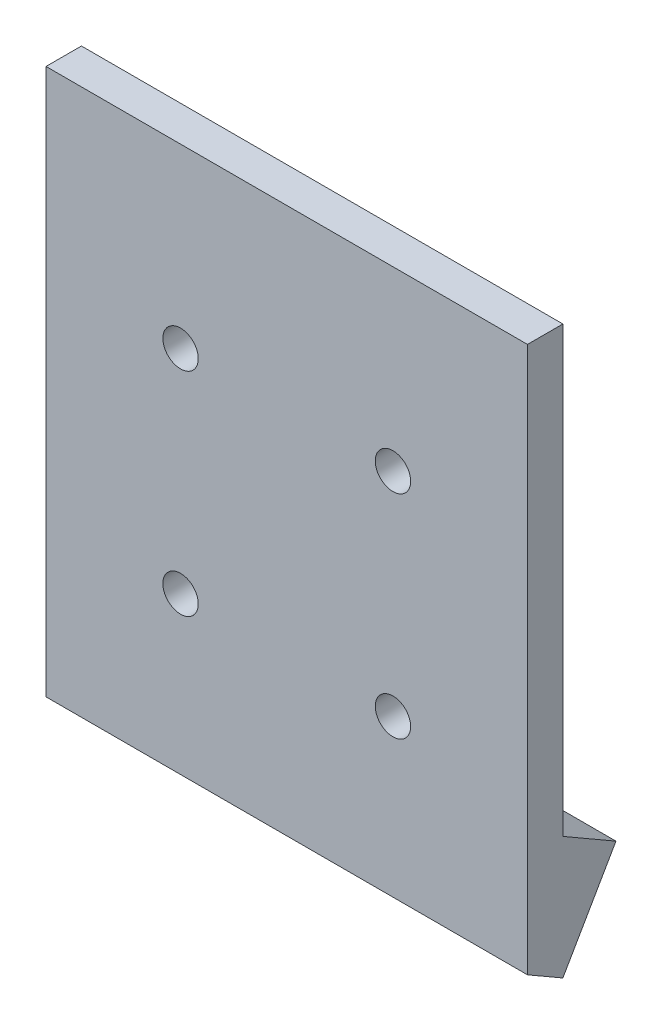
ISO-10303-21;
HEADER;
FILE_DESCRIPTION(('STEP AP214'),'2;1');
FILE_NAME('part.step','',(''),(''),'','','');
FILE_SCHEMA(('AUTOMOTIVE_DESIGN { 1 0 10303 214 1 1 1 1 }'));
ENDSEC;
DATA;
#1=APPLICATION_CONTEXT('core data for automotive mechanical design processes');
#2=APPLICATION_PROTOCOL_DEFINITION('international standard','automotive_design',2000,#1);
#3=PRODUCT_CONTEXT('',#1,'mechanical');
#4=PRODUCT('Part','Part','',(#3));
#5=PRODUCT_RELATED_PRODUCT_CATEGORY('part','',(#4));
#6=PRODUCT_DEFINITION_FORMATION('','',#4);
#7=PRODUCT_DEFINITION_CONTEXT('part definition',#1,'design');
#8=PRODUCT_DEFINITION('design','',#6,#7);
#9=PRODUCT_DEFINITION_SHAPE('','',#8);
#10=(LENGTH_UNIT() NAMED_UNIT(*) SI_UNIT(.MILLI.,.METRE.));
#11=(NAMED_UNIT(*) PLANE_ANGLE_UNIT() SI_UNIT($,.RADIAN.));
#12=(NAMED_UNIT(*) SI_UNIT($,.STERADIAN.) SOLID_ANGLE_UNIT());
#13=UNCERTAINTY_MEASURE_WITH_UNIT(LENGTH_MEASURE(1.E-05),#10,'distance_accuracy_value','');
#14=(GEOMETRIC_REPRESENTATION_CONTEXT(3) GLOBAL_UNCERTAINTY_ASSIGNED_CONTEXT((#13)) GLOBAL_UNIT_ASSIGNED_CONTEXT((#10,
#11,#12)) REPRESENTATION_CONTEXT('',''));
#15=CARTESIAN_POINT('',(0.,0.,0.));
#16=DIRECTION('',(0.,0.,1.));
#17=DIRECTION('',(1.,0.,0.));
#18=AXIS2_PLACEMENT_3D('',#15,#16,#17);
#19=CARTESIAN_POINT('',(0.,0.,6.35));
#20=DIRECTION('',(0.,0.,-1.));
#21=DIRECTION('',(-1.,0.,0.));
#22=AXIS2_PLACEMENT_3D('',#19,#20,#21);
#23=PLANE('',#22);
#24=DIRECTION('',(0.,-1.,0.));
#25=VECTOR('',#24,1.);
#26=CARTESIAN_POINT('',(-43.18,-50.8,6.35));
#27=LINE('',#26,#25);
#28=CARTESIAN_POINT('',(-43.18,50.8,6.35));
#29=VERTEX_POINT('',#28);
#30=CARTESIAN_POINT('',(-43.18,-47.1338257906459,6.35));
#31=VERTEX_POINT('',#30);
#32=EDGE_CURVE('E148',#29,#31,#27,.T.);
#33=ORIENTED_EDGE('',*,*,#32,.T.);
#34=DIRECTION('',(1.,0.,0.));
#35=VECTOR('',#34,1.);
#36=CARTESIAN_POINT('',(-43.18,-47.1338257906459,6.35));
#37=LINE('',#36,#35);
#38=CARTESIAN_POINT('',(43.18,-47.1338257906459,6.35));
#39=VERTEX_POINT('',#38);
#40=EDGE_CURVE('E84',#31,#39,#37,.T.);
#41=ORIENTED_EDGE('',*,*,#40,.T.);
#42=DIRECTION('',(0.,1.,0.));
#43=VECTOR('',#42,1.);
#44=CARTESIAN_POINT('',(43.18,-50.8,6.35));
#45=LINE('',#44,#43);
#46=CARTESIAN_POINT('',(43.18,50.8,6.35));
#47=VERTEX_POINT('',#46);
#48=EDGE_CURVE('E100',#39,#47,#45,.T.);
#49=ORIENTED_EDGE('',*,*,#48,.T.);
#50=DIRECTION('',(-1.,0.,0.));
#51=VECTOR('',#50,1.);
#52=CARTESIAN_POINT('',(-43.18,50.8,6.35));
#53=LINE('',#52,#51);
#54=EDGE_CURVE('E59',#47,#29,#53,.T.);
#55=ORIENTED_EDGE('',*,*,#54,.T.);
#56=EDGE_LOOP('',(#33,#41,#49,#55));
#57=FACE_BOUND('',#56,.T.);
#58=CARTESIAN_POINT('',(-19.05,19.05,6.35));
#59=DIRECTION('',(0.,0.,1.));
#60=DIRECTION('',(1.,0.,0.));
#61=AXIS2_PLACEMENT_3D('',#58,#59,#60);
#62=CIRCLE('',#61,3.175);
#63=CARTESIAN_POINT('',(-15.875,19.05,6.35));
#64=VERTEX_POINT('',#63);
#65=EDGE_CURVE('E140',#64,#64,#62,.T.);
#66=ORIENTED_EDGE('',*,*,#65,.F.);
#67=EDGE_LOOP('',(#66));
#68=FACE_BOUND('',#67,.T.);
#69=CARTESIAN_POINT('',(19.05,19.05,6.35));
#70=DIRECTION('',(0.,0.,1.));
#71=DIRECTION('',(1.,0.,0.));
#72=AXIS2_PLACEMENT_3D('',#69,#70,#71);
#73=CIRCLE('',#72,3.175);
#74=CARTESIAN_POINT('',(22.225,19.05,6.35));
#75=VERTEX_POINT('',#74);
#76=EDGE_CURVE('E134',#75,#75,#73,.T.);
#77=ORIENTED_EDGE('',*,*,#76,.F.);
#78=EDGE_LOOP('',(#77));
#79=FACE_BOUND('',#78,.T.);
#80=CARTESIAN_POINT('',(-19.05,-19.05,6.35));
#81=DIRECTION('',(0.,0.,1.));
#82=DIRECTION('',(1.,0.,0.));
#83=AXIS2_PLACEMENT_3D('',#80,#81,#82);
#84=CIRCLE('',#83,3.175);
#85=CARTESIAN_POINT('',(-15.875,-19.05,6.35));
#86=VERTEX_POINT('',#85);
#87=EDGE_CURVE('E128',#86,#86,#84,.T.);
#88=ORIENTED_EDGE('',*,*,#87,.F.);
#89=EDGE_LOOP('',(#88));
#90=FACE_BOUND('',#89,.T.);
#91=CARTESIAN_POINT('',(19.05,-19.05,6.35));
#92=DIRECTION('',(0.,0.,1.));
#93=DIRECTION('',(1.,0.,0.));
#94=AXIS2_PLACEMENT_3D('',#91,#92,#93);
#95=CIRCLE('',#94,3.175);
#96=CARTESIAN_POINT('',(22.225,-19.05,6.35));
#97=VERTEX_POINT('',#96);
#98=EDGE_CURVE('E122',#97,#97,#95,.T.);
#99=ORIENTED_EDGE('',*,*,#98,.F.);
#100=EDGE_LOOP('',(#99));
#101=FACE_BOUND('',#100,.T.);
#102=ADVANCED_FACE('F33',(#57,#68,#79,#90,#101),#23,.F.);
#103=CARTESIAN_POINT('',(0.,0.,0.));
#104=DIRECTION('',(0.,0.,-1.));
#105=DIRECTION('',(-1.,0.,0.));
#106=AXIS2_PLACEMENT_3D('',#103,#104,#105);
#107=PLANE('',#106);
#108=DIRECTION('',(1.,0.,0.));
#109=VECTOR('',#108,1.);
#110=CARTESIAN_POINT('',(-43.18,-28.8029547438753,0.));
#111=LINE('',#110,#109);
#112=CARTESIAN_POINT('',(-43.18,-28.8029547438753,0.));
#113=VERTEX_POINT('',#112);
#114=CARTESIAN_POINT('',(43.18,-28.8029547438753,0.));
#115=VERTEX_POINT('',#114);
#116=EDGE_CURVE('E50',#113,#115,#111,.T.);
#117=ORIENTED_EDGE('',*,*,#116,.F.);
#118=DIRECTION('',(0.,-1.,0.));
#119=VECTOR('',#118,1.);
#120=CARTESIAN_POINT('',(-43.18,-50.8,0.));
#121=LINE('',#120,#119);
#122=CARTESIAN_POINT('',(-43.18,50.8,0.));
#123=VERTEX_POINT('',#122);
#124=EDGE_CURVE('E101',#123,#113,#121,.T.);
#125=ORIENTED_EDGE('',*,*,#124,.F.);
#126=DIRECTION('',(-1.,0.,0.));
#127=VECTOR('',#126,1.);
#128=CARTESIAN_POINT('',(-43.18,50.8,0.));
#129=LINE('',#128,#127);
#130=CARTESIAN_POINT('',(43.18,50.8,0.));
#131=VERTEX_POINT('',#130);
#132=EDGE_CURVE('E151',#131,#123,#129,.T.);
#133=ORIENTED_EDGE('',*,*,#132,.F.);
#134=DIRECTION('',(0.,1.,0.));
#135=VECTOR('',#134,1.);
#136=CARTESIAN_POINT('',(43.18,-50.8,0.));
#137=LINE('',#136,#135);
#138=EDGE_CURVE('E143',#115,#131,#137,.T.);
#139=ORIENTED_EDGE('',*,*,#138,.F.);
#140=EDGE_LOOP('',(#117,#125,#133,#139));
#141=FACE_BOUND('',#140,.T.);
#142=CARTESIAN_POINT('',(-19.05,-19.05,0.));
#143=DIRECTION('',(0.,0.,1.));
#144=DIRECTION('',(1.,0.,0.));
#145=AXIS2_PLACEMENT_3D('',#142,#143,#144);
#146=CIRCLE('',#145,3.175);
#147=CARTESIAN_POINT('',(-15.875,-19.05,0.));
#148=VERTEX_POINT('',#147);
#149=EDGE_CURVE('E125',#148,#148,#146,.T.);
#150=ORIENTED_EDGE('',*,*,#149,.T.);
#151=EDGE_LOOP('',(#150));
#152=FACE_BOUND('',#151,.T.);
#153=CARTESIAN_POINT('',(-19.05,19.05,0.));
#154=DIRECTION('',(0.,0.,1.));
#155=DIRECTION('',(1.,0.,0.));
#156=AXIS2_PLACEMENT_3D('',#153,#154,#155);
#157=CIRCLE('',#156,3.175);
#158=CARTESIAN_POINT('',(-15.875,19.05,0.));
#159=VERTEX_POINT('',#158);
#160=EDGE_CURVE('E137',#159,#159,#157,.T.);
#161=ORIENTED_EDGE('',*,*,#160,.T.);
#162=EDGE_LOOP('',(#161));
#163=FACE_BOUND('',#162,.T.);
#164=CARTESIAN_POINT('',(19.05,19.05,0.));
#165=DIRECTION('',(0.,0.,1.));
#166=DIRECTION('',(1.,0.,0.));
#167=AXIS2_PLACEMENT_3D('',#164,#165,#166);
#168=CIRCLE('',#167,3.175);
#169=CARTESIAN_POINT('',(22.225,19.05,0.));
#170=VERTEX_POINT('',#169);
#171=EDGE_CURVE('E131',#170,#170,#168,.T.);
#172=ORIENTED_EDGE('',*,*,#171,.T.);
#173=EDGE_LOOP('',(#172));
#174=FACE_BOUND('',#173,.T.);
#175=CARTESIAN_POINT('',(19.05,-19.05,0.));
#176=DIRECTION('',(0.,0.,1.));
#177=DIRECTION('',(1.,0.,0.));
#178=AXIS2_PLACEMENT_3D('',#175,#176,#177);
#179=CIRCLE('',#178,3.175);
#180=CARTESIAN_POINT('',(22.225,-19.05,0.));
#181=VERTEX_POINT('',#180);
#182=EDGE_CURVE('E121',#181,#181,#179,.T.);
#183=ORIENTED_EDGE('',*,*,#182,.T.);
#184=EDGE_LOOP('',(#183));
#185=FACE_BOUND('',#184,.T.);
#186=ADVANCED_FACE('F185',(#141,#152,#163,#174,#185),#107,.T.);
#187=CARTESIAN_POINT('',(43.18,-50.8,6.35));
#188=DIRECTION('',(-1.,0.,0.));
#189=DIRECTION('',(0.,0.,1.));
#190=AXIS2_PLACEMENT_3D('',#187,#188,#189);
#191=PLANE('',#190);
#192=ORIENTED_EDGE('',*,*,#48,.F.);
#193=DIRECTION('',(0.,0.499999999999994,0.866025403784442));
#194=VECTOR('',#193,1.);
#195=CARTESIAN_POINT('',(43.18,-50.8,0.));
#196=LINE('',#195,#194);
#197=CARTESIAN_POINT('',(43.18,-50.8,0.));
#198=VERTEX_POINT('',#197);
#199=EDGE_CURVE('E88',#198,#39,#196,.T.);
#200=ORIENTED_EDGE('',*,*,#199,.F.);
#201=DIRECTION('',(0.,0.866025403784442,-0.499999999999995));
#202=VECTOR('',#201,1.);
#203=CARTESIAN_POINT('',(43.18,-50.8,0.));
#204=LINE('',#203,#202);
#205=CARTESIAN_POINT('',(43.18,-34.3022160579064,-9.5249999999999));
#206=VERTEX_POINT('',#205);
#207=EDGE_CURVE('E99',#198,#206,#204,.T.);
#208=ORIENTED_EDGE('',*,*,#207,.T.);
#209=DIRECTION('',(0.,0.5,0.866025403784439));
#210=VECTOR('',#209,1.);
#211=CARTESIAN_POINT('',(43.18,-34.3022160579064,-9.5249999999999));
#212=LINE('',#211,#210);
#213=EDGE_CURVE('E106',#206,#115,#212,.T.);
#214=ORIENTED_EDGE('',*,*,#213,.T.);
#215=ORIENTED_EDGE('',*,*,#138,.T.);
#216=DIRECTION('',(0.,0.,-1.));
#217=VECTOR('',#216,1.);
#218=CARTESIAN_POINT('',(43.18,50.8,6.35));
#219=LINE('',#218,#217);
#220=EDGE_CURVE('E11',#47,#131,#219,.T.);
#221=ORIENTED_EDGE('',*,*,#220,.F.);
#222=EDGE_LOOP('',(#192,#200,#208,#214,#215,#221));
#223=FACE_BOUND('',#222,.T.);
#224=ADVANCED_FACE('F35',(#223),#191,.F.);
#225=CARTESIAN_POINT('',(-43.18,50.8,6.35));
#226=DIRECTION('',(0.,-1.,0.));
#227=DIRECTION('',(0.,0.,-1.));
#228=AXIS2_PLACEMENT_3D('',#225,#226,#227);
#229=PLANE('',#228);
#230=ORIENTED_EDGE('',*,*,#132,.T.);
#231=DIRECTION('',(0.,0.,-1.));
#232=VECTOR('',#231,1.);
#233=CARTESIAN_POINT('',(-43.18,50.8,6.35));
#234=LINE('',#233,#232);
#235=EDGE_CURVE('E42',#29,#123,#234,.T.);
#236=ORIENTED_EDGE('',*,*,#235,.F.);
#237=ORIENTED_EDGE('',*,*,#54,.F.);
#238=ORIENTED_EDGE('',*,*,#220,.T.);
#239=EDGE_LOOP('',(#230,#236,#237,#238));
#240=FACE_BOUND('',#239,.T.);
#241=ADVANCED_FACE('F197',(#240),#229,.F.);
#242=CARTESIAN_POINT('',(-43.18,-50.8,6.35));
#243=DIRECTION('',(1.,0.,0.));
#244=DIRECTION('',(0.,0.,-1.));
#245=AXIS2_PLACEMENT_3D('',#242,#243,#244);
#246=PLANE('',#245);
#247=ORIENTED_EDGE('',*,*,#124,.T.);
#248=DIRECTION('',(0.,0.5,0.866025403784439));
#249=VECTOR('',#248,1.);
#250=CARTESIAN_POINT('',(-43.18,-34.3022160579064,-9.5249999999999));
#251=LINE('',#250,#249);
#252=CARTESIAN_POINT('',(-43.18,-34.3022160579064,-9.5249999999999));
#253=VERTEX_POINT('',#252);
#254=EDGE_CURVE('E105',#253,#113,#251,.T.);
#255=ORIENTED_EDGE('',*,*,#254,.F.);
#256=DIRECTION('',(0.,0.866025403784442,-0.499999999999995));
#257=VECTOR('',#256,1.);
#258=CARTESIAN_POINT('',(-43.18,-50.8,0.));
#259=LINE('',#258,#257);
#260=CARTESIAN_POINT('',(-43.18,-50.8,0.));
#261=VERTEX_POINT('',#260);
#262=EDGE_CURVE('E96',#261,#253,#259,.T.);
#263=ORIENTED_EDGE('',*,*,#262,.F.);
#264=DIRECTION('',(0.,0.499999999999994,0.866025403784442));
#265=VECTOR('',#264,1.);
#266=CARTESIAN_POINT('',(-43.18,-50.8,0.));
#267=LINE('',#266,#265);
#268=EDGE_CURVE('E76',#261,#31,#267,.T.);
#269=ORIENTED_EDGE('',*,*,#268,.T.);
#270=ORIENTED_EDGE('',*,*,#32,.F.);
#271=ORIENTED_EDGE('',*,*,#235,.T.);
#272=EDGE_LOOP('',(#247,#255,#263,#269,#270,#271));
#273=FACE_BOUND('',#272,.T.);
#274=ADVANCED_FACE('F103',(#273),#246,.F.);
#275=CARTESIAN_POINT('',(-19.05,19.05,6.35));
#276=DIRECTION('',(0.,0.,-1.));
#277=DIRECTION('',(-1.,0.,0.));
#278=AXIS2_PLACEMENT_3D('',#275,#276,#277);
#279=CYLINDRICAL_SURFACE('',#278,3.175);
#280=ORIENTED_EDGE('',*,*,#65,.T.);
#281=EDGE_LOOP('',(#280));
#282=FACE_BOUND('',#281,.T.);
#283=ORIENTED_EDGE('',*,*,#160,.F.);
#284=EDGE_LOOP('',(#283));
#285=FACE_BOUND('',#284,.T.);
#286=ADVANCED_FACE('F193',(#282,#285),#279,.F.);
#287=CARTESIAN_POINT('',(19.05,19.05,6.35));
#288=DIRECTION('',(0.,0.,-1.));
#289=DIRECTION('',(-1.,0.,0.));
#290=AXIS2_PLACEMENT_3D('',#287,#288,#289);
#291=CYLINDRICAL_SURFACE('',#290,3.175);
#292=ORIENTED_EDGE('',*,*,#76,.T.);
#293=EDGE_LOOP('',(#292));
#294=FACE_BOUND('',#293,.T.);
#295=ORIENTED_EDGE('',*,*,#171,.F.);
#296=EDGE_LOOP('',(#295));
#297=FACE_BOUND('',#296,.T.);
#298=ADVANCED_FACE('F216',(#294,#297),#291,.F.);
#299=CARTESIAN_POINT('',(-19.05,-19.05,6.35));
#300=DIRECTION('',(0.,0.,-1.));
#301=DIRECTION('',(-1.,0.,0.));
#302=AXIS2_PLACEMENT_3D('',#299,#300,#301);
#303=CYLINDRICAL_SURFACE('',#302,3.175);
#304=ORIENTED_EDGE('',*,*,#87,.T.);
#305=EDGE_LOOP('',(#304));
#306=FACE_BOUND('',#305,.T.);
#307=ORIENTED_EDGE('',*,*,#149,.F.);
#308=EDGE_LOOP('',(#307));
#309=FACE_BOUND('',#308,.T.);
#310=ADVANCED_FACE('F180',(#306,#309),#303,.F.);
#311=CARTESIAN_POINT('',(19.05,-19.05,6.35));
#312=DIRECTION('',(0.,0.,-1.));
#313=DIRECTION('',(-1.,0.,0.));
#314=AXIS2_PLACEMENT_3D('',#311,#312,#313);
#315=CYLINDRICAL_SURFACE('',#314,3.175);
#316=ORIENTED_EDGE('',*,*,#98,.T.);
#317=EDGE_LOOP('',(#316));
#318=FACE_BOUND('',#317,.T.);
#319=ORIENTED_EDGE('',*,*,#182,.F.);
#320=EDGE_LOOP('',(#319));
#321=FACE_BOUND('',#320,.T.);
#322=ADVANCED_FACE('F171',(#318,#321),#315,.F.);
#323=CARTESIAN_POINT('',(-43.18,-50.8,0.));
#324=DIRECTION('',(0.,0.866025403784442,-0.499999999999995));
#325=DIRECTION('',(0.,0.499999999999995,0.866025403784442));
#326=AXIS2_PLACEMENT_3D('',#323,#324,#325);
#327=PLANE('',#326);
#328=CARTESIAN_POINT('',(-31.75,-48.966912895323,3.175));
#329=DIRECTION('',(0.,-0.866025403784442,0.499999999999995));
#330=DIRECTION('',(0.,-0.499999999999995,-0.866025403784442));
#331=AXIS2_PLACEMENT_3D('',#328,#329,#330);
#332=CIRCLE('',#331,2.1828125);
#333=CARTESIAN_POINT('',(-31.75,-50.058319145323,1.28462892330177));
#334=VERTEX_POINT('',#333);
#335=EDGE_CURVE('E157',#334,#334,#332,.T.);
#336=ORIENTED_EDGE('',*,*,#335,.F.);
#337=EDGE_LOOP('',(#336));
#338=FACE_BOUND('',#337,.T.);
#339=CARTESIAN_POINT('',(31.75,-48.966912895323,3.175));
#340=DIRECTION('',(0.,-0.866025403784442,0.499999999999995));
#341=DIRECTION('',(0.,-0.499999999999995,-0.866025403784442));
#342=AXIS2_PLACEMENT_3D('',#339,#340,#341);
#343=CIRCLE('',#342,2.1828125);
#344=CARTESIAN_POINT('',(31.75,-50.058319145323,1.28462892330177));
#345=VERTEX_POINT('',#344);
#346=EDGE_CURVE('E113',#345,#345,#343,.T.);
#347=ORIENTED_EDGE('',*,*,#346,.F.);
#348=EDGE_LOOP('',(#347));
#349=FACE_BOUND('',#348,.T.);
#350=ORIENTED_EDGE('',*,*,#199,.T.);
#351=ORIENTED_EDGE('',*,*,#40,.F.);
#352=ORIENTED_EDGE('',*,*,#268,.F.);
#353=DIRECTION('',(1.,0.,0.));
#354=VECTOR('',#353,1.);
#355=CARTESIAN_POINT('',(-43.18,-50.8,0.));
#356=LINE('',#355,#354);
#357=EDGE_CURVE('E81',#261,#198,#356,.T.);
#358=ORIENTED_EDGE('',*,*,#357,.T.);
#359=EDGE_LOOP('',(#350,#351,#352,#358));
#360=FACE_BOUND('',#359,.T.);
#361=ADVANCED_FACE('F79',(#338,#349,#360),#327,.F.);
#362=CARTESIAN_POINT('',(-43.18,-34.3022160579064,-9.5249999999999));
#363=DIRECTION('',(0.,0.866025403784439,-0.5));
#364=DIRECTION('',(0.,0.5,0.866025403784439));
#365=AXIS2_PLACEMENT_3D('',#362,#363,#364);
#366=PLANE('',#365);
#367=CARTESIAN_POINT('',(-31.75,-32.4691289532294,-6.34999999999992));
#368=DIRECTION('',(0.,0.866025403784439,-0.5));
#369=DIRECTION('',(0.,0.5,0.866025403784439));
#370=AXIS2_PLACEMENT_3D('',#367,#368,#369);
#371=CIRCLE('',#370,2.1828125);
#372=CARTESIAN_POINT('',(-31.75,-31.3777227032293,-4.4596289233017));
#373=VERTEX_POINT('',#372);
#374=EDGE_CURVE('E37',#373,#373,#371,.T.);
#375=ORIENTED_EDGE('',*,*,#374,.F.);
#376=EDGE_LOOP('',(#375));
#377=FACE_BOUND('',#376,.T.);
#378=CARTESIAN_POINT('',(31.75,-32.4691289532294,-6.34999999999992));
#379=DIRECTION('',(0.,0.866025403784439,-0.5));
#380=DIRECTION('',(0.,0.5,0.866025403784439));
#381=AXIS2_PLACEMENT_3D('',#378,#379,#380);
#382=CIRCLE('',#381,2.1828125);
#383=CARTESIAN_POINT('',(31.75,-31.3777227032293,-4.4596289233017));
#384=VERTEX_POINT('',#383);
#385=EDGE_CURVE('E155',#384,#384,#382,.T.);
#386=ORIENTED_EDGE('',*,*,#385,.F.);
#387=EDGE_LOOP('',(#386));
#388=FACE_BOUND('',#387,.T.);
#389=ORIENTED_EDGE('',*,*,#213,.F.);
#390=DIRECTION('',(1.,0.,0.));
#391=VECTOR('',#390,1.);
#392=CARTESIAN_POINT('',(-43.18,-34.3022160579064,-9.5249999999999));
#393=LINE('',#392,#391);
#394=EDGE_CURVE('E108',#253,#206,#393,.T.);
#395=ORIENTED_EDGE('',*,*,#394,.F.);
#396=ORIENTED_EDGE('',*,*,#254,.T.);
#397=ORIENTED_EDGE('',*,*,#116,.T.);
#398=EDGE_LOOP('',(#389,#395,#396,#397));
#399=FACE_BOUND('',#398,.T.);
#400=ADVANCED_FACE('F170',(#377,#388,#399),#366,.T.);
#401=CARTESIAN_POINT('',(-43.18,-50.8,0.));
#402=DIRECTION('',(0.,-0.499999999999995,-0.866025403784442));
#403=DIRECTION('',(0.,0.866025403784442,-0.499999999999995));
#404=AXIS2_PLACEMENT_3D('',#401,#402,#403);
#405=PLANE('',#404);
#406=ORIENTED_EDGE('',*,*,#207,.F.);
#407=ORIENTED_EDGE('',*,*,#357,.F.);
#408=ORIENTED_EDGE('',*,*,#262,.T.);
#409=ORIENTED_EDGE('',*,*,#394,.T.);
#410=EDGE_LOOP('',(#406,#407,#408,#409));
#411=FACE_BOUND('',#410,.T.);
#412=ADVANCED_FACE('F93',(#411),#405,.T.);
#413=CARTESIAN_POINT('',(31.75,31.3575330902009,-43.2003405122491));
#414=DIRECTION('',(0.,-0.866025403784442,0.499999999999995));
#415=DIRECTION('',(0.,-0.499999999999995,-0.866025403784442));
#416=AXIS2_PLACEMENT_3D('',#413,#414,#415);
#417=CYLINDRICAL_SURFACE('',#416,2.1828125);
#418=ORIENTED_EDGE('',*,*,#385,.T.);
#419=EDGE_LOOP('',(#418));
#420=FACE_BOUND('',#419,.T.);
#421=ORIENTED_EDGE('',*,*,#346,.T.);
#422=EDGE_LOOP('',(#421));
#423=FACE_BOUND('',#422,.T.);
#424=ADVANCED_FACE('F167',(#420,#423),#417,.F.);
#425=CARTESIAN_POINT('',(-31.75,31.3575330902009,-43.2003405122491));
#426=DIRECTION('',(0.,-0.866025403784442,0.499999999999995));
#427=DIRECTION('',(0.,-0.499999999999995,-0.866025403784442));
#428=AXIS2_PLACEMENT_3D('',#425,#426,#427);
#429=CYLINDRICAL_SURFACE('',#428,2.1828125);
#430=ORIENTED_EDGE('',*,*,#374,.T.);
#431=EDGE_LOOP('',(#430));
#432=FACE_BOUND('',#431,.T.);
#433=ORIENTED_EDGE('',*,*,#335,.T.);
#434=EDGE_LOOP('',(#433));
#435=FACE_BOUND('',#434,.T.);
#436=ADVANCED_FACE('F273',(#432,#435),#429,.F.);
#437=CLOSED_SHELL('',(#102,#186,#224,#241,#274,#286,#298,#310,#322,#361,#400,#412,#424,#436));
#438=MANIFOLD_SOLID_BREP('B2',#437);
#439=ADVANCED_BREP_SHAPE_REPRESENTATION('',(#18,#438),#14);
#440=SHAPE_DEFINITION_REPRESENTATION(#9,#439);
ENDSEC;
END-ISO-10303-21;
